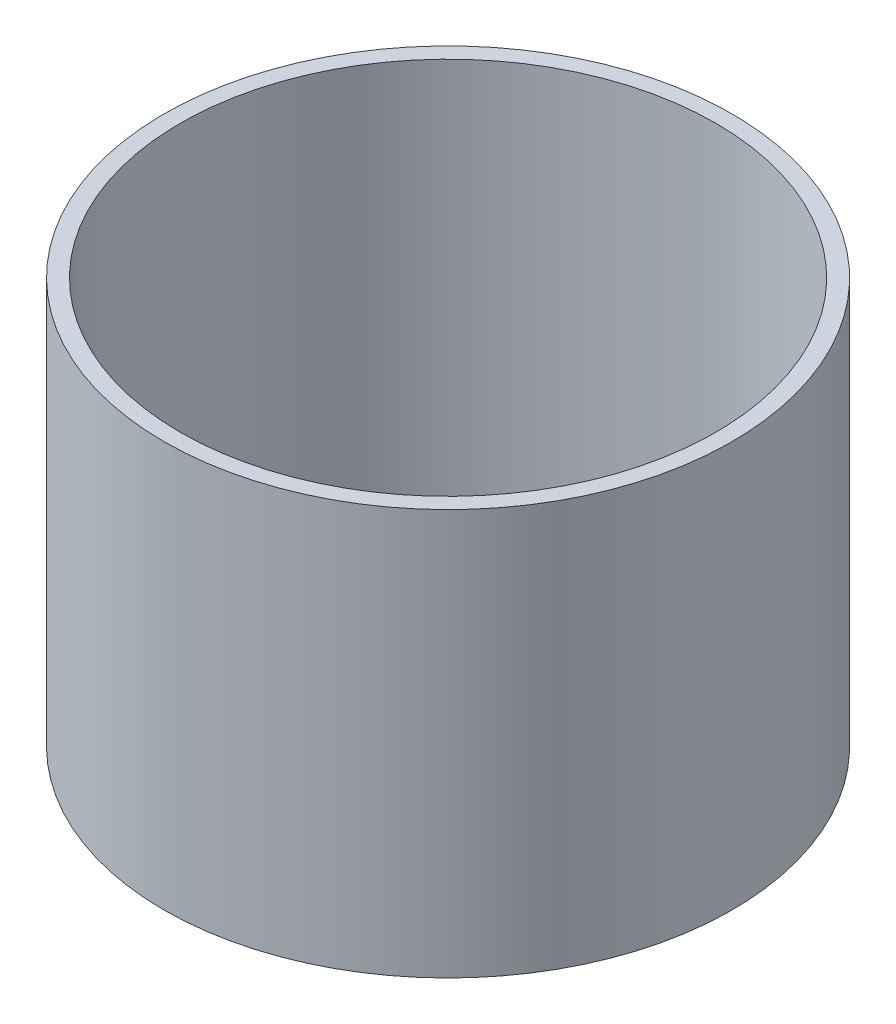
ISO-10303-21;
HEADER;
FILE_DESCRIPTION(('STEP AP214'),'2;1');
FILE_NAME('part.step','',(''),(''),'','','');
FILE_SCHEMA(('AUTOMOTIVE_DESIGN { 1 0 10303 214 1 1 1 1 }'));
ENDSEC;
DATA;
#1=APPLICATION_CONTEXT('core data for automotive mechanical design processes');
#2=APPLICATION_PROTOCOL_DEFINITION('international standard','automotive_design',2000,#1);
#3=PRODUCT_CONTEXT('',#1,'mechanical');
#4=PRODUCT('Part','Part','',(#3));
#5=PRODUCT_RELATED_PRODUCT_CATEGORY('part','',(#4));
#6=PRODUCT_DEFINITION_FORMATION('','',#4);
#7=PRODUCT_DEFINITION_CONTEXT('part definition',#1,'design');
#8=PRODUCT_DEFINITION('design','',#6,#7);
#9=PRODUCT_DEFINITION_SHAPE('','',#8);
#10=(LENGTH_UNIT() NAMED_UNIT(*) SI_UNIT(.MILLI.,.METRE.));
#11=(NAMED_UNIT(*) PLANE_ANGLE_UNIT() SI_UNIT($,.RADIAN.));
#12=(NAMED_UNIT(*) SI_UNIT($,.STERADIAN.) SOLID_ANGLE_UNIT());
#13=UNCERTAINTY_MEASURE_WITH_UNIT(LENGTH_MEASURE(1.E-05),#10,'distance_accuracy_value','');
#14=(GEOMETRIC_REPRESENTATION_CONTEXT(3) GLOBAL_UNCERTAINTY_ASSIGNED_CONTEXT((#13)) GLOBAL_UNIT_ASSIGNED_CONTEXT((#10,
#11,#12)) REPRESENTATION_CONTEXT('',''));
#15=CARTESIAN_POINT('',(0.,0.,0.));
#16=DIRECTION('',(0.,0.,1.));
#17=DIRECTION('',(1.,0.,0.));
#18=AXIS2_PLACEMENT_3D('',#15,#16,#17);
#19=CARTESIAN_POINT('',(0.,25.,0.));
#20=DIRECTION('',(0.,1.,0.));
#21=DIRECTION('',(0.,0.,1.));
#22=AXIS2_PLACEMENT_3D('',#19,#20,#21);
#23=PLANE('',#22);
#24=CARTESIAN_POINT('',(0.,25.,0.));
#25=DIRECTION('',(0.,1.,0.));
#26=DIRECTION('',(0.,0.,1.));
#27=AXIS2_PLACEMENT_3D('',#24,#25,#26);
#28=CIRCLE('',#27,17.5);
#29=CARTESIAN_POINT('',(0.,25.,17.5));
#30=VERTEX_POINT('',#29);
#31=EDGE_CURVE('E10',#30,#30,#28,.T.);
#32=ORIENTED_EDGE('',*,*,#31,.T.);
#33=EDGE_LOOP('',(#32));
#34=FACE_BOUND('',#33,.T.);
#35=CARTESIAN_POINT('',(0.,25.,0.));
#36=DIRECTION('',(0.,1.,0.));
#37=DIRECTION('',(0.,0.,1.));
#38=AXIS2_PLACEMENT_3D('',#35,#36,#37);
#39=CIRCLE('',#38,16.5);
#40=CARTESIAN_POINT('',(0.,25.,16.5));
#41=VERTEX_POINT('',#40);
#42=EDGE_CURVE('E42',#41,#41,#39,.T.);
#43=ORIENTED_EDGE('',*,*,#42,.F.);
#44=EDGE_LOOP('',(#43));
#45=FACE_BOUND('',#44,.T.);
#46=ADVANCED_FACE('F31',(#34,#45),#23,.T.);
#47=CARTESIAN_POINT('',(0.,0.,0.));
#48=DIRECTION('',(0.,1.,0.));
#49=DIRECTION('',(0.,0.,1.));
#50=AXIS2_PLACEMENT_3D('',#47,#48,#49);
#51=PLANE('',#50);
#52=CARTESIAN_POINT('',(0.,0.,0.));
#53=DIRECTION('',(0.,1.,0.));
#54=DIRECTION('',(0.,0.,1.));
#55=AXIS2_PLACEMENT_3D('',#52,#53,#54);
#56=CIRCLE('',#55,17.5);
#57=CARTESIAN_POINT('',(0.,0.,17.5));
#58=VERTEX_POINT('',#57);
#59=EDGE_CURVE('E35',#58,#58,#56,.T.);
#60=ORIENTED_EDGE('',*,*,#59,.F.);
#61=EDGE_LOOP('',(#60));
#62=FACE_BOUND('',#61,.T.);
#63=CARTESIAN_POINT('',(0.,0.,0.));
#64=DIRECTION('',(0.,1.,0.));
#65=DIRECTION('',(0.,0.,1.));
#66=AXIS2_PLACEMENT_3D('',#63,#64,#65);
#67=CIRCLE('',#66,16.5);
#68=CARTESIAN_POINT('',(0.,0.,16.5));
#69=VERTEX_POINT('',#68);
#70=EDGE_CURVE('E44',#69,#69,#67,.T.);
#71=ORIENTED_EDGE('',*,*,#70,.T.);
#72=EDGE_LOOP('',(#71));
#73=FACE_BOUND('',#72,.T.);
#74=ADVANCED_FACE('F54',(#62,#73),#51,.F.);
#75=CARTESIAN_POINT('',(0.,25.,0.));
#76=DIRECTION('',(0.,-1.,0.));
#77=DIRECTION('',(0.,0.,-1.));
#78=AXIS2_PLACEMENT_3D('',#75,#76,#77);
#79=CYLINDRICAL_SURFACE('',#78,17.5);
#80=ORIENTED_EDGE('',*,*,#31,.F.);
#81=EDGE_LOOP('',(#80));
#82=FACE_BOUND('',#81,.T.);
#83=ORIENTED_EDGE('',*,*,#59,.T.);
#84=EDGE_LOOP('',(#83));
#85=FACE_BOUND('',#84,.T.);
#86=ADVANCED_FACE('F33',(#82,#85),#79,.T.);
#87=CARTESIAN_POINT('',(0.,25.,0.));
#88=DIRECTION('',(0.,-1.,0.));
#89=DIRECTION('',(0.,0.,-1.));
#90=AXIS2_PLACEMENT_3D('',#87,#88,#89);
#91=CYLINDRICAL_SURFACE('',#90,16.5);
#92=ORIENTED_EDGE('',*,*,#42,.T.);
#93=EDGE_LOOP('',(#92));
#94=FACE_BOUND('',#93,.T.);
#95=ORIENTED_EDGE('',*,*,#70,.F.);
#96=EDGE_LOOP('',(#95));
#97=FACE_BOUND('',#96,.T.);
#98=ADVANCED_FACE('F50',(#94,#97),#91,.F.);
#99=CLOSED_SHELL('',(#46,#74,#86,#98));
#100=MANIFOLD_SOLID_BREP('B2',#99);
#101=ADVANCED_BREP_SHAPE_REPRESENTATION('',(#18,#100),#14);
#102=SHAPE_DEFINITION_REPRESENTATION(#9,#101);
ENDSEC;
END-ISO-10303-21;
